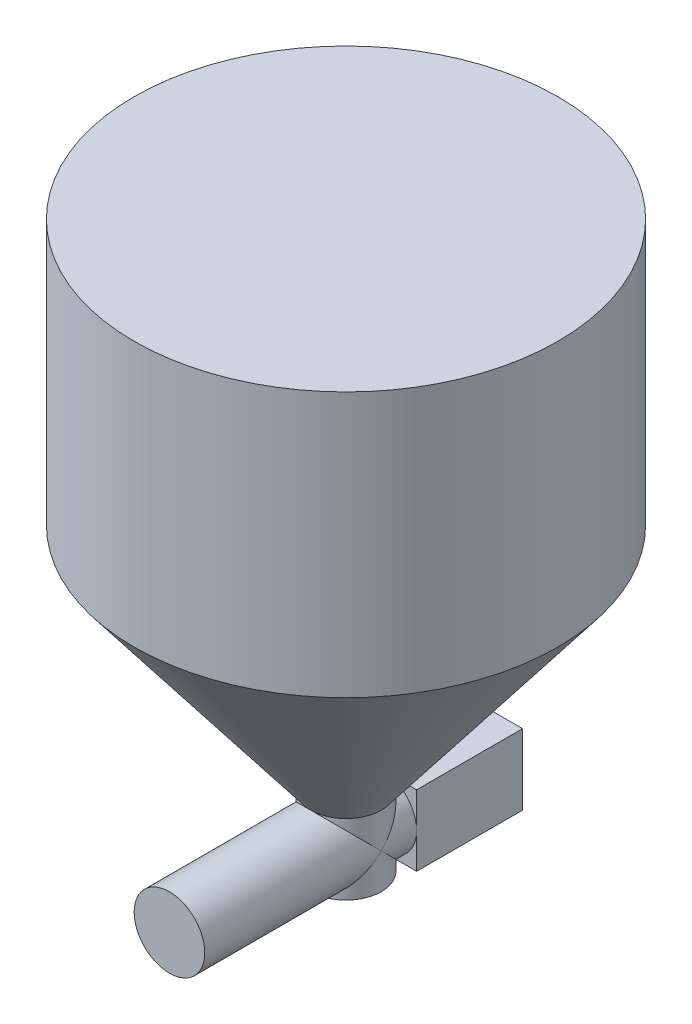
ISO-10303-21;
HEADER;
FILE_DESCRIPTION(('STEP AP214'),'2;1');
FILE_NAME('part.step','',(''),(''),'','','');
FILE_SCHEMA(('AUTOMOTIVE_DESIGN { 1 0 10303 214 1 1 1 1 }'));
ENDSEC;
DATA;
#1=APPLICATION_CONTEXT('core data for automotive mechanical design processes');
#2=APPLICATION_PROTOCOL_DEFINITION('international standard','automotive_design',2000,#1);
#3=PRODUCT_CONTEXT('',#1,'mechanical');
#4=PRODUCT('Part','Part','',(#3));
#5=PRODUCT_RELATED_PRODUCT_CATEGORY('part','',(#4));
#6=PRODUCT_DEFINITION_FORMATION('','',#4);
#7=PRODUCT_DEFINITION_CONTEXT('part definition',#1,'design');
#8=PRODUCT_DEFINITION('design','',#6,#7);
#9=PRODUCT_DEFINITION_SHAPE('','',#8);
#10=(LENGTH_UNIT() NAMED_UNIT(*) SI_UNIT(.MILLI.,.METRE.));
#11=(NAMED_UNIT(*) PLANE_ANGLE_UNIT() SI_UNIT($,.RADIAN.));
#12=(NAMED_UNIT(*) SI_UNIT($,.STERADIAN.) SOLID_ANGLE_UNIT());
#13=UNCERTAINTY_MEASURE_WITH_UNIT(LENGTH_MEASURE(1.E-05),#10,'distance_accuracy_value','');
#14=(GEOMETRIC_REPRESENTATION_CONTEXT(3) GLOBAL_UNCERTAINTY_ASSIGNED_CONTEXT((#13)) GLOBAL_UNIT_ASSIGNED_CONTEXT((#10,
#11,#12)) REPRESENTATION_CONTEXT('',''));
#15=CARTESIAN_POINT('',(0.,0.,0.));
#16=DIRECTION('',(0.,0.,1.));
#17=DIRECTION('',(1.,0.,0.));
#18=AXIS2_PLACEMENT_3D('',#15,#16,#17);
#19=CARTESIAN_POINT('',(0.,-800.,0.));
#20=DIRECTION('',(0.,1.,0.));
#21=DIRECTION('',(0.,0.,1.));
#22=AXIS2_PLACEMENT_3D('',#19,#20,#21);
#23=CYLINDRICAL_SURFACE('',#22,50.);
#24=CARTESIAN_POINT('',(0.,-750.,0.));
#25=DIRECTION('',(0.,0.707106781186547,-0.707106781186547));
#26=DIRECTION('',(0.,0.707106781186547,0.707106781186547));
#27=AXIS2_PLACEMENT_3D('',#24,#25,#26);
#28=ELLIPSE('',#27,70.7106781186548,50.);
#29=CARTESIAN_POINT('',(-2.22044604925031E-13,-700.,50.));
#30=VERTEX_POINT('',#29);
#31=CARTESIAN_POINT('',(50.,-750.,0.));
#32=VERTEX_POINT('',#31);
#33=EDGE_CURVE('E207',#30,#32,#28,.T.);
#34=ORIENTED_EDGE('',*,*,#33,.T.);
#35=CARTESIAN_POINT('',(0.,-750.,0.));
#36=DIRECTION('',(0.,0.707106781186547,0.707106781186547));
#37=DIRECTION('',(0.,0.707106781186547,-0.707106781186547));
#38=AXIS2_PLACEMENT_3D('',#35,#36,#37);
#39=ELLIPSE('',#38,70.7106781186548,50.);
#40=CARTESIAN_POINT('',(0.,-700.,-50.));
#41=VERTEX_POINT('',#40);
#42=EDGE_CURVE('E202',#32,#41,#39,.T.);
#43=ORIENTED_EDGE('',*,*,#42,.T.);
#44=CARTESIAN_POINT('',(0.,-700.,0.));
#45=DIRECTION('',(0.,-1.,0.));
#46=DIRECTION('',(0.,0.,-1.));
#47=AXIS2_PLACEMENT_3D('',#44,#45,#46);
#48=CIRCLE('',#47,50.);
#49=EDGE_CURVE('E227',#41,#30,#48,.T.);
#50=ORIENTED_EDGE('',*,*,#49,.T.);
#51=EDGE_LOOP('',(#34,#43,#50));
#52=FACE_BOUND('',#51,.T.);
#53=ADVANCED_FACE('F37',(#52),#23,.T.);
#54=CARTESIAN_POINT('',(0.,-375.,0.));
#55=DIRECTION('',(0.,1.,0.));
#56=DIRECTION('',(0.,0.,1.));
#57=AXIS2_PLACEMENT_3D('',#54,#55,#56);
#58=CYLINDRICAL_SURFACE('',#57,300.);
#59=CARTESIAN_POINT('',(0.,-375.,0.));
#60=DIRECTION('',(0.,-1.,0.));
#61=DIRECTION('',(0.,0.,-1.));
#62=AXIS2_PLACEMENT_3D('',#59,#60,#61);
#63=CIRCLE('',#62,300.);
#64=CARTESIAN_POINT('',(0.,-375.,-300.));
#65=VERTEX_POINT('',#64);
#66=EDGE_CURVE('E47',#65,#65,#63,.T.);
#67=ORIENTED_EDGE('',*,*,#66,.F.);
#68=EDGE_LOOP('',(#67));
#69=FACE_BOUND('',#68,.T.);
#70=CARTESIAN_POINT('',(0.,0.,0.));
#71=DIRECTION('',(0.,1.,0.));
#72=DIRECTION('',(0.,0.,1.));
#73=AXIS2_PLACEMENT_3D('',#70,#71,#72);
#74=CIRCLE('',#73,300.);
#75=CARTESIAN_POINT('',(0.,0.,300.));
#76=VERTEX_POINT('',#75);
#77=EDGE_CURVE('E12',#76,#76,#74,.T.);
#78=ORIENTED_EDGE('',*,*,#77,.F.);
#79=EDGE_LOOP('',(#78));
#80=FACE_BOUND('',#79,.T.);
#81=ADVANCED_FACE('F39',(#69,#80),#58,.T.);
#82=CARTESIAN_POINT('',(0.,0.,0.));
#83=DIRECTION('',(0.,1.,0.));
#84=DIRECTION('',(0.,0.,1.));
#85=AXIS2_PLACEMENT_3D('',#82,#83,#84);
#86=PLANE('',#85);
#87=ORIENTED_EDGE('',*,*,#77,.T.);
#88=EDGE_LOOP('',(#87));
#89=FACE_BOUND('',#88,.T.);
#90=ADVANCED_FACE('F243',(#89),#86,.T.);
#91=CARTESIAN_POINT('',(0.,-700.,0.));
#92=DIRECTION('',(0.,1.,0.));
#93=DIRECTION('',(0.,0.,1.));
#94=AXIS2_PLACEMENT_3D('',#91,#92,#93);
#95=CONICAL_SURFACE('',#94,50.,0.655695626241536);
#96=ORIENTED_EDGE('',*,*,#49,.F.);
#97=CARTESIAN_POINT('',(0.,-700.,0.));
#98=DIRECTION('',(0.,-1.,0.));
#99=DIRECTION('',(0.,0.,1.));
#100=AXIS2_PLACEMENT_3D('',#97,#98,#99);
#101=CIRCLE('',#100,50.);
#102=EDGE_CURVE('E277',#30,#41,#101,.T.);
#103=ORIENTED_EDGE('',*,*,#102,.F.);
#104=EDGE_LOOP('',(#96,#103));
#105=FACE_BOUND('',#104,.T.);
#106=ORIENTED_EDGE('',*,*,#66,.T.);
#107=EDGE_LOOP('',(#106));
#108=FACE_BOUND('',#107,.T.);
#109=ADVANCED_FACE('F233',(#105,#108),#95,.T.);
#110=CARTESIAN_POINT('',(-50.,-750.,0.));
#111=VERTEX_POINT('',#110);
#112=EDGE_CURVE('E198',#41,#111,#39,.T.);
#113=ORIENTED_EDGE('',*,*,#112,.T.);
#114=EDGE_CURVE('E210',#111,#30,#28,.T.);
#115=ORIENTED_EDGE('',*,*,#114,.T.);
#116=ORIENTED_EDGE('',*,*,#102,.T.);
#117=EDGE_LOOP('',(#113,#115,#116));
#118=FACE_BOUND('',#117,.T.);
#119=ADVANCED_FACE('F242',(#118),#23,.T.);
#120=CARTESIAN_POINT('',(0.,-750.,250.));
#121=DIRECTION('',(0.,0.,-1.));
#122=DIRECTION('',(-1.,0.,0.));
#123=AXIS2_PLACEMENT_3D('',#120,#121,#122);
#124=PLANE('',#123);
#125=CARTESIAN_POINT('',(0.,-750.,250.));
#126=DIRECTION('',(0.,0.,-1.));
#127=DIRECTION('',(-1.,0.,0.));
#128=AXIS2_PLACEMENT_3D('',#125,#126,#127);
#129=CIRCLE('',#128,50.);
#130=CARTESIAN_POINT('',(-50.,-750.,250.));
#131=VERTEX_POINT('',#130);
#132=EDGE_CURVE('E188',#131,#131,#129,.T.);
#133=ORIENTED_EDGE('',*,*,#132,.F.);
#134=EDGE_LOOP('',(#133));
#135=FACE_BOUND('',#134,.T.);
#136=ADVANCED_FACE('F268',(#135),#124,.F.);
#137=CARTESIAN_POINT('',(0.,-750.,250.));
#138=DIRECTION('',(0.,0.,-1.));
#139=DIRECTION('',(-1.,0.,0.));
#140=AXIS2_PLACEMENT_3D('',#137,#138,#139);
#141=CYLINDRICAL_SURFACE('',#140,50.);
#142=ORIENTED_EDGE('',*,*,#132,.T.);
#143=EDGE_LOOP('',(#142));
#144=FACE_BOUND('',#143,.T.);
#145=CARTESIAN_POINT('',(0.,-750.,0.));
#146=DIRECTION('',(0.,0.707106781186547,0.707106781186547));
#147=DIRECTION('',(0.,0.707106781186547,-0.707106781186547));
#148=AXIS2_PLACEMENT_3D('',#145,#146,#147);
#149=ELLIPSE('',#148,70.7106781186548,50.);
#150=CARTESIAN_POINT('',(0.,-800.,50.));
#151=VERTEX_POINT('',#150);
#152=EDGE_CURVE('E199',#32,#151,#149,.F.);
#153=ORIENTED_EDGE('',*,*,#152,.F.);
#154=ORIENTED_EDGE('',*,*,#33,.F.);
#155=ORIENTED_EDGE('',*,*,#114,.F.);
#156=EDGE_CURVE('E63',#151,#111,#149,.F.);
#157=ORIENTED_EDGE('',*,*,#156,.F.);
#158=EDGE_LOOP('',(#153,#154,#155,#157));
#159=FACE_BOUND('',#158,.T.);
#160=ADVANCED_FACE('F273',(#144,#159),#141,.T.);
#161=CARTESIAN_POINT('',(0.,-750.,0.));
#162=DIRECTION('',(0.,0.707106781186547,-0.707106781186547));
#163=DIRECTION('',(0.,0.707106781186547,0.707106781186547));
#164=AXIS2_PLACEMENT_3D('',#161,#162,#163);
#165=ELLIPSE('',#164,70.7106781186548,50.);
#166=CARTESIAN_POINT('',(0.,-800.,-50.));
#167=VERTEX_POINT('',#166);
#168=EDGE_CURVE('E219',#111,#167,#165,.F.);
#169=ORIENTED_EDGE('',*,*,#168,.F.);
#170=ORIENTED_EDGE('',*,*,#112,.F.);
#171=CARTESIAN_POINT('',(0.,-750.,-50.));
#172=DIRECTION('',(0.,0.,-1.));
#173=DIRECTION('',(-1.,0.,0.));
#174=AXIS2_PLACEMENT_3D('',#171,#172,#173);
#175=CIRCLE('',#174,50.);
#176=CARTESIAN_POINT('',(-50.,-750.,-50.));
#177=VERTEX_POINT('',#176);
#178=EDGE_CURVE('E55',#41,#177,#175,.F.);
#179=ORIENTED_EDGE('',*,*,#178,.T.);
#180=CARTESIAN_POINT('',(0.,-750.,-50.));
#181=DIRECTION('',(0.,0.,-1.));
#182=DIRECTION('',(-1.,0.,0.));
#183=AXIS2_PLACEMENT_3D('',#180,#181,#182);
#184=CIRCLE('',#183,50.);
#185=EDGE_CURVE('E176',#167,#177,#184,.T.);
#186=ORIENTED_EDGE('',*,*,#185,.F.);
#187=EDGE_LOOP('',(#169,#170,#179,#186));
#188=FACE_BOUND('',#187,.T.);
#189=ADVANCED_FACE('F278',(#188),#141,.T.);
#190=EDGE_CURVE('E216',#167,#32,#165,.F.);
#191=ORIENTED_EDGE('',*,*,#190,.F.);
#192=CARTESIAN_POINT('',(0.,-750.,-50.));
#193=DIRECTION('',(0.,0.,-1.));
#194=DIRECTION('',(-1.,0.,0.));
#195=AXIS2_PLACEMENT_3D('',#192,#193,#194);
#196=CIRCLE('',#195,50.);
#197=CARTESIAN_POINT('',(50.,-750.,-50.));
#198=VERTEX_POINT('',#197);
#199=EDGE_CURVE('E134',#167,#198,#196,.F.);
#200=ORIENTED_EDGE('',*,*,#199,.T.);
#201=EDGE_CURVE('E178',#41,#198,#184,.T.);
#202=ORIENTED_EDGE('',*,*,#201,.F.);
#203=ORIENTED_EDGE('',*,*,#42,.F.);
#204=EDGE_LOOP('',(#191,#200,#202,#203));
#205=FACE_BOUND('',#204,.T.);
#206=ADVANCED_FACE('F265',(#205),#141,.T.);
#207=CARTESIAN_POINT('',(0.,-800.,0.));
#208=DIRECTION('',(0.,-1.,0.));
#209=DIRECTION('',(0.,0.,-1.));
#210=AXIS2_PLACEMENT_3D('',#207,#208,#209);
#211=PLANE('',#210);
#212=CARTESIAN_POINT('',(0.,-800.,0.));
#213=DIRECTION('',(0.,-1.,0.));
#214=DIRECTION('',(0.,0.,-1.));
#215=AXIS2_PLACEMENT_3D('',#212,#213,#214);
#216=CIRCLE('',#215,50.);
#217=EDGE_CURVE('E223',#151,#167,#216,.T.);
#218=ORIENTED_EDGE('',*,*,#217,.T.);
#219=EDGE_CURVE('E220',#167,#151,#216,.T.);
#220=ORIENTED_EDGE('',*,*,#219,.T.);
#221=EDGE_LOOP('',(#218,#220));
#222=FACE_BOUND('',#221,.T.);
#223=ADVANCED_FACE('F261',(#222),#211,.T.);
#224=ORIENTED_EDGE('',*,*,#156,.T.);
#225=ORIENTED_EDGE('',*,*,#168,.T.);
#226=ORIENTED_EDGE('',*,*,#217,.F.);
#227=EDGE_LOOP('',(#224,#225,#226));
#228=FACE_BOUND('',#227,.T.);
#229=ADVANCED_FACE('F255',(#228),#23,.T.);
#230=ORIENTED_EDGE('',*,*,#190,.T.);
#231=ORIENTED_EDGE('',*,*,#152,.T.);
#232=ORIENTED_EDGE('',*,*,#219,.F.);
#233=EDGE_LOOP('',(#230,#231,#232));
#234=FACE_BOUND('',#233,.T.);
#235=ADVANCED_FACE('F254',(#234),#23,.T.);
#236=CARTESIAN_POINT('',(0.,0.,-50.));
#237=DIRECTION('',(0.,0.,-1.));
#238=DIRECTION('',(-1.,0.,0.));
#239=AXIS2_PLACEMENT_3D('',#236,#237,#238);
#240=PLANE('',#239);
#241=ORIENTED_EDGE('',*,*,#185,.T.);
#242=DIRECTION('',(0.,1.,0.));
#243=VECTOR('',#242,1.);
#244=CARTESIAN_POINT('',(-50.,-700.,-50.));
#245=LINE('',#244,#243);
#246=CARTESIAN_POINT('',(-50.,-800.,-50.));
#247=VERTEX_POINT('',#246);
#248=EDGE_CURVE('E145',#247,#177,#245,.T.);
#249=ORIENTED_EDGE('',*,*,#248,.F.);
#250=DIRECTION('',(-1.,0.,0.));
#251=VECTOR('',#250,1.);
#252=CARTESIAN_POINT('',(50.,-800.,-50.));
#253=LINE('',#252,#251);
#254=EDGE_CURVE('E154',#167,#247,#253,.T.);
#255=ORIENTED_EDGE('',*,*,#254,.F.);
#256=EDGE_LOOP('',(#241,#249,#255));
#257=FACE_BOUND('',#256,.T.);
#258=ADVANCED_FACE('F175',(#257),#240,.F.);
#259=ORIENTED_EDGE('',*,*,#178,.F.);
#260=DIRECTION('',(1.,0.,0.));
#261=VECTOR('',#260,1.);
#262=CARTESIAN_POINT('',(50.,-700.,-50.));
#263=LINE('',#262,#261);
#264=CARTESIAN_POINT('',(-50.,-700.,-50.));
#265=VERTEX_POINT('',#264);
#266=EDGE_CURVE('E144',#265,#41,#263,.T.);
#267=ORIENTED_EDGE('',*,*,#266,.F.);
#268=EDGE_CURVE('E132',#177,#265,#245,.T.);
#269=ORIENTED_EDGE('',*,*,#268,.F.);
#270=EDGE_LOOP('',(#259,#267,#269));
#271=FACE_BOUND('',#270,.T.);
#272=ADVANCED_FACE('F181',(#271),#240,.F.);
#273=ORIENTED_EDGE('',*,*,#199,.F.);
#274=CARTESIAN_POINT('',(50.,-800.,-50.));
#275=VERTEX_POINT('',#274);
#276=EDGE_CURVE('E127',#275,#167,#253,.T.);
#277=ORIENTED_EDGE('',*,*,#276,.F.);
#278=DIRECTION('',(0.,-1.,0.));
#279=VECTOR('',#278,1.);
#280=CARTESIAN_POINT('',(50.,-700.,-50.));
#281=LINE('',#280,#279);
#282=EDGE_CURVE('E155',#198,#275,#281,.T.);
#283=ORIENTED_EDGE('',*,*,#282,.F.);
#284=EDGE_LOOP('',(#273,#277,#283));
#285=FACE_BOUND('',#284,.T.);
#286=ADVANCED_FACE('F168',(#285),#240,.F.);
#287=CARTESIAN_POINT('',(-50.,-700.,-200.));
#288=DIRECTION('',(1.,0.,0.));
#289=DIRECTION('',(0.,1.,0.));
#290=AXIS2_PLACEMENT_3D('',#287,#288,#289);
#291=PLANE('',#290);
#292=ORIENTED_EDGE('',*,*,#248,.T.);
#293=ORIENTED_EDGE('',*,*,#268,.T.);
#294=DIRECTION('',(0.,0.,1.));
#295=VECTOR('',#294,1.);
#296=CARTESIAN_POINT('',(-50.,-700.,-200.));
#297=LINE('',#296,#295);
#298=CARTESIAN_POINT('',(-50.,-700.,-200.));
#299=VERTEX_POINT('',#298);
#300=EDGE_CURVE('E112',#299,#265,#297,.T.);
#301=ORIENTED_EDGE('',*,*,#300,.F.);
#302=DIRECTION('',(0.,1.,0.));
#303=VECTOR('',#302,1.);
#304=CARTESIAN_POINT('',(-50.,-700.,-200.));
#305=LINE('',#304,#303);
#306=CARTESIAN_POINT('',(-50.,-800.,-200.));
#307=VERTEX_POINT('',#306);
#308=EDGE_CURVE('E118',#307,#299,#305,.T.);
#309=ORIENTED_EDGE('',*,*,#308,.F.);
#310=DIRECTION('',(0.,0.,1.));
#311=VECTOR('',#310,1.);
#312=CARTESIAN_POINT('',(-50.,-800.,-200.));
#313=LINE('',#312,#311);
#314=EDGE_CURVE('E158',#307,#247,#313,.T.);
#315=ORIENTED_EDGE('',*,*,#314,.T.);
#316=EDGE_LOOP('',(#292,#293,#301,#309,#315));
#317=FACE_BOUND('',#316,.T.);
#318=ADVANCED_FACE('F130',(#317),#291,.F.);
#319=CARTESIAN_POINT('',(50.,-700.,-200.));
#320=DIRECTION('',(0.,-1.,0.));
#321=DIRECTION('',(0.,0.,-1.));
#322=AXIS2_PLACEMENT_3D('',#319,#320,#321);
#323=PLANE('',#322);
#324=ORIENTED_EDGE('',*,*,#266,.T.);
#325=CARTESIAN_POINT('',(50.,-700.,-50.));
#326=VERTEX_POINT('',#325);
#327=EDGE_CURVE('E141',#41,#326,#263,.T.);
#328=ORIENTED_EDGE('',*,*,#327,.T.);
#329=DIRECTION('',(0.,0.,1.));
#330=VECTOR('',#329,1.);
#331=CARTESIAN_POINT('',(50.,-700.,-200.));
#332=LINE('',#331,#330);
#333=CARTESIAN_POINT('',(50.,-700.,-200.));
#334=VERTEX_POINT('',#333);
#335=EDGE_CURVE('E114',#334,#326,#332,.T.);
#336=ORIENTED_EDGE('',*,*,#335,.F.);
#337=DIRECTION('',(1.,0.,0.));
#338=VECTOR('',#337,1.);
#339=CARTESIAN_POINT('',(50.,-700.,-200.));
#340=LINE('',#339,#338);
#341=EDGE_CURVE('E107',#299,#334,#340,.T.);
#342=ORIENTED_EDGE('',*,*,#341,.F.);
#343=ORIENTED_EDGE('',*,*,#300,.T.);
#344=EDGE_LOOP('',(#324,#328,#336,#342,#343));
#345=FACE_BOUND('',#344,.T.);
#346=ADVANCED_FACE('F110',(#345),#323,.F.);
#347=CARTESIAN_POINT('',(50.,-700.,-200.));
#348=DIRECTION('',(-1.,0.,0.));
#349=DIRECTION('',(0.,-1.,0.));
#350=AXIS2_PLACEMENT_3D('',#347,#348,#349);
#351=PLANE('',#350);
#352=EDGE_CURVE('E150',#326,#198,#281,.T.);
#353=ORIENTED_EDGE('',*,*,#352,.T.);
#354=ORIENTED_EDGE('',*,*,#282,.T.);
#355=DIRECTION('',(0.,0.,1.));
#356=VECTOR('',#355,1.);
#357=CARTESIAN_POINT('',(50.,-800.,-200.));
#358=LINE('',#357,#356);
#359=CARTESIAN_POINT('',(50.,-800.,-200.));
#360=VERTEX_POINT('',#359);
#361=EDGE_CURVE('E137',#360,#275,#358,.T.);
#362=ORIENTED_EDGE('',*,*,#361,.F.);
#363=DIRECTION('',(0.,-1.,0.));
#364=VECTOR('',#363,1.);
#365=CARTESIAN_POINT('',(50.,-700.,-200.));
#366=LINE('',#365,#364);
#367=EDGE_CURVE('E117',#334,#360,#366,.T.);
#368=ORIENTED_EDGE('',*,*,#367,.F.);
#369=ORIENTED_EDGE('',*,*,#335,.T.);
#370=EDGE_LOOP('',(#353,#354,#362,#368,#369));
#371=FACE_BOUND('',#370,.T.);
#372=ADVANCED_FACE('F183',(#371),#351,.F.);
#373=CARTESIAN_POINT('',(50.,-800.,-200.));
#374=DIRECTION('',(0.,1.,0.));
#375=DIRECTION('',(0.,0.,1.));
#376=AXIS2_PLACEMENT_3D('',#373,#374,#375);
#377=PLANE('',#376);
#378=ORIENTED_EDGE('',*,*,#276,.T.);
#379=ORIENTED_EDGE('',*,*,#254,.T.);
#380=ORIENTED_EDGE('',*,*,#314,.F.);
#381=DIRECTION('',(-1.,0.,0.));
#382=VECTOR('',#381,1.);
#383=CARTESIAN_POINT('',(50.,-800.,-200.));
#384=LINE('',#383,#382);
#385=EDGE_CURVE('E123',#360,#307,#384,.T.);
#386=ORIENTED_EDGE('',*,*,#385,.F.);
#387=ORIENTED_EDGE('',*,*,#361,.T.);
#388=EDGE_LOOP('',(#378,#379,#380,#386,#387));
#389=FACE_BOUND('',#388,.T.);
#390=ADVANCED_FACE('F163',(#389),#377,.F.);
#391=CARTESIAN_POINT('',(0.,0.,-200.));
#392=DIRECTION('',(0.,0.,-1.));
#393=DIRECTION('',(-1.,0.,0.));
#394=AXIS2_PLACEMENT_3D('',#391,#392,#393);
#395=PLANE('',#394);
#396=ORIENTED_EDGE('',*,*,#308,.T.);
#397=ORIENTED_EDGE('',*,*,#341,.T.);
#398=ORIENTED_EDGE('',*,*,#367,.T.);
#399=ORIENTED_EDGE('',*,*,#385,.T.);
#400=EDGE_LOOP('',(#396,#397,#398,#399));
#401=FACE_BOUND('',#400,.T.);
#402=ADVANCED_FACE('F121',(#401),#395,.T.);
#403=ORIENTED_EDGE('',*,*,#201,.T.);
#404=ORIENTED_EDGE('',*,*,#352,.F.);
#405=ORIENTED_EDGE('',*,*,#327,.F.);
#406=EDGE_LOOP('',(#403,#404,#405));
#407=FACE_BOUND('',#406,.T.);
#408=ADVANCED_FACE('F186',(#407),#240,.F.);
#409=CLOSED_SHELL('',(#53,#81,#90,#109,#119,#136,#160,#189,#206,#223,#229,#235,#258,#272,#286,
#318,#346,#372,#390,#402,#408));
#410=MANIFOLD_SOLID_BREP('B2',#409);
#411=ADVANCED_BREP_SHAPE_REPRESENTATION('',(#18,#410),#14);
#412=SHAPE_DEFINITION_REPRESENTATION(#9,#411);
ENDSEC;
END-ISO-10303-21;
